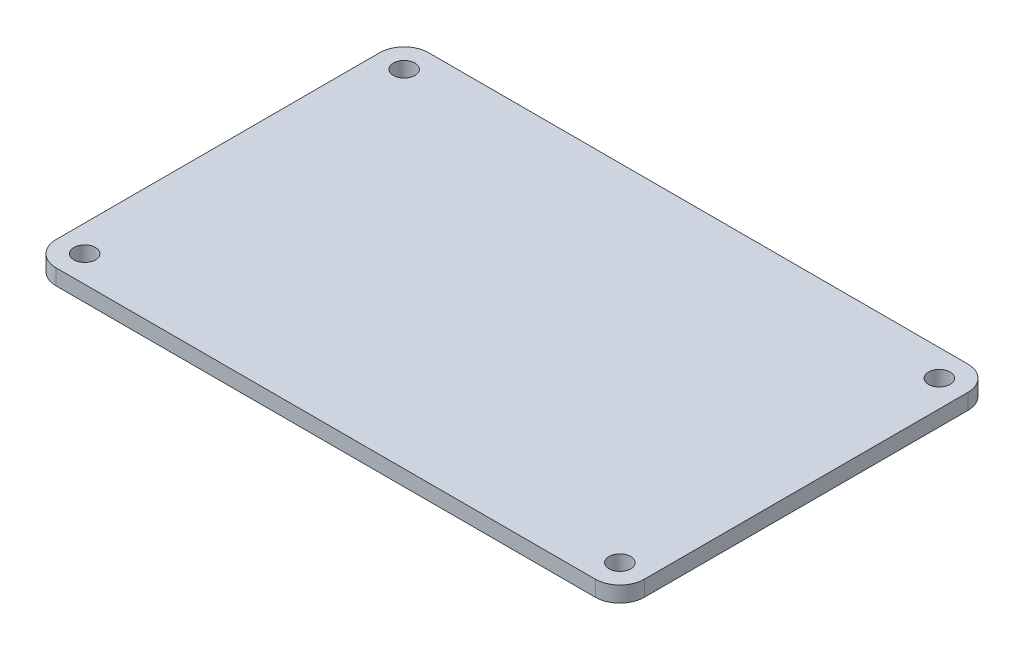
ISO-10303-21;
HEADER;
FILE_DESCRIPTION(('STEP AP214'),'2;1');
FILE_NAME('part.step','',(''),(''),'','','');
FILE_SCHEMA(('AUTOMOTIVE_DESIGN { 1 0 10303 214 1 1 1 1 }'));
ENDSEC;
DATA;
#1=APPLICATION_CONTEXT('core data for automotive mechanical design processes');
#2=APPLICATION_PROTOCOL_DEFINITION('international standard','automotive_design',2000,#1);
#3=PRODUCT_CONTEXT('',#1,'mechanical');
#4=PRODUCT('Part','Part','',(#3));
#5=PRODUCT_RELATED_PRODUCT_CATEGORY('part','',(#4));
#6=PRODUCT_DEFINITION_FORMATION('','',#4);
#7=PRODUCT_DEFINITION_CONTEXT('part definition',#1,'design');
#8=PRODUCT_DEFINITION('design','',#6,#7);
#9=PRODUCT_DEFINITION_SHAPE('','',#8);
#10=(LENGTH_UNIT() NAMED_UNIT(*) SI_UNIT(.MILLI.,.METRE.));
#11=(NAMED_UNIT(*) PLANE_ANGLE_UNIT() SI_UNIT($,.RADIAN.));
#12=(NAMED_UNIT(*) SI_UNIT($,.STERADIAN.) SOLID_ANGLE_UNIT());
#13=UNCERTAINTY_MEASURE_WITH_UNIT(LENGTH_MEASURE(1.E-05),#10,'distance_accuracy_value','');
#14=(GEOMETRIC_REPRESENTATION_CONTEXT(3) GLOBAL_UNCERTAINTY_ASSIGNED_CONTEXT((#13)) GLOBAL_UNIT_ASSIGNED_CONTEXT((#10,
#11,#12)) REPRESENTATION_CONTEXT('',''));
#15=CARTESIAN_POINT('',(0.,0.,0.));
#16=DIRECTION('',(0.,0.,1.));
#17=DIRECTION('',(1.,0.,0.));
#18=AXIS2_PLACEMENT_3D('',#15,#16,#17);
#19=CARTESIAN_POINT('',(-27.5,1.6,-16.5));
#20=DIRECTION('',(0.,-1.,0.));
#21=DIRECTION('',(0.,0.,-1.));
#22=AXIS2_PLACEMENT_3D('',#19,#20,#21);
#23=CYLINDRICAL_SURFACE('',#22,2.5);
#24=CARTESIAN_POINT('',(-27.5,0.,-16.5));
#25=DIRECTION('',(0.,1.,0.));
#26=DIRECTION('',(0.,0.,1.));
#27=AXIS2_PLACEMENT_3D('',#24,#25,#26);
#28=CIRCLE('',#27,2.5);
#29=CARTESIAN_POINT('',(-27.5,0.,-19.));
#30=VERTEX_POINT('',#29);
#31=CARTESIAN_POINT('',(-30.,0.,-16.5));
#32=VERTEX_POINT('',#31);
#33=EDGE_CURVE('E140',#30,#32,#28,.T.);
#34=ORIENTED_EDGE('',*,*,#33,.T.);
#35=DIRECTION('',(0.,-1.,0.));
#36=VECTOR('',#35,1.);
#37=CARTESIAN_POINT('',(-30.,1.6,-16.5));
#38=LINE('',#37,#36);
#39=CARTESIAN_POINT('',(-30.,1.6,-16.5));
#40=VERTEX_POINT('',#39);
#41=EDGE_CURVE('E11',#40,#32,#38,.T.);
#42=ORIENTED_EDGE('',*,*,#41,.F.);
#43=CARTESIAN_POINT('',(-27.5,1.6,-16.5));
#44=DIRECTION('',(0.,1.,0.));
#45=DIRECTION('',(0.,0.,1.));
#46=AXIS2_PLACEMENT_3D('',#43,#44,#45);
#47=CIRCLE('',#46,2.5);
#48=CARTESIAN_POINT('',(-27.5,1.6,-19.));
#49=VERTEX_POINT('',#48);
#50=EDGE_CURVE('E163',#49,#40,#47,.T.);
#51=ORIENTED_EDGE('',*,*,#50,.F.);
#52=DIRECTION('',(0.,-1.,0.));
#53=VECTOR('',#52,1.);
#54=CARTESIAN_POINT('',(-27.5,1.6,-19.));
#55=LINE('',#54,#53);
#56=EDGE_CURVE('E136',#49,#30,#55,.T.);
#57=ORIENTED_EDGE('',*,*,#56,.T.);
#58=EDGE_LOOP('',(#34,#42,#51,#57));
#59=FACE_BOUND('',#58,.T.);
#60=ADVANCED_FACE('F39',(#59),#23,.T.);
#61=CARTESIAN_POINT('',(-30.,1.6,-16.5));
#62=DIRECTION('',(1.,0.,0.));
#63=DIRECTION('',(0.,0.,-1.));
#64=AXIS2_PLACEMENT_3D('',#61,#62,#63);
#65=PLANE('',#64);
#66=DIRECTION('',(0.,0.,1.));
#67=VECTOR('',#66,1.);
#68=CARTESIAN_POINT('',(-30.,0.,-16.5));
#69=LINE('',#68,#67);
#70=CARTESIAN_POINT('',(-30.,0.,16.5));
#71=VERTEX_POINT('',#70);
#72=EDGE_CURVE('E144',#32,#71,#69,.T.);
#73=ORIENTED_EDGE('',*,*,#72,.T.);
#74=DIRECTION('',(0.,-1.,0.));
#75=VECTOR('',#74,1.);
#76=CARTESIAN_POINT('',(-30.,1.6,16.5));
#77=LINE('',#76,#75);
#78=CARTESIAN_POINT('',(-30.,1.6,16.5));
#79=VERTEX_POINT('',#78);
#80=EDGE_CURVE('E48',#79,#71,#77,.T.);
#81=ORIENTED_EDGE('',*,*,#80,.F.);
#82=DIRECTION('',(0.,0.,1.));
#83=VECTOR('',#82,1.);
#84=CARTESIAN_POINT('',(-30.,1.6,-16.5));
#85=LINE('',#84,#83);
#86=EDGE_CURVE('E99',#40,#79,#85,.T.);
#87=ORIENTED_EDGE('',*,*,#86,.F.);
#88=ORIENTED_EDGE('',*,*,#41,.T.);
#89=EDGE_LOOP('',(#73,#81,#87,#88));
#90=FACE_BOUND('',#89,.T.);
#91=ADVANCED_FACE('F267',(#90),#65,.F.);
#92=CARTESIAN_POINT('',(-27.5,1.6,16.5));
#93=DIRECTION('',(0.,-1.,0.));
#94=DIRECTION('',(0.,0.,-1.));
#95=AXIS2_PLACEMENT_3D('',#92,#93,#94);
#96=CYLINDRICAL_SURFACE('',#95,2.5);
#97=CARTESIAN_POINT('',(-27.5,0.,16.5));
#98=DIRECTION('',(0.,1.,0.));
#99=DIRECTION('',(0.,0.,-1.));
#100=AXIS2_PLACEMENT_3D('',#97,#98,#99);
#101=CIRCLE('',#100,2.5);
#102=CARTESIAN_POINT('',(-27.5,0.,19.));
#103=VERTEX_POINT('',#102);
#104=EDGE_CURVE('E148',#71,#103,#101,.T.);
#105=ORIENTED_EDGE('',*,*,#104,.T.);
#106=DIRECTION('',(0.,-1.,0.));
#107=VECTOR('',#106,1.);
#108=CARTESIAN_POINT('',(-27.5,1.6,19.));
#109=LINE('',#108,#107);
#110=CARTESIAN_POINT('',(-27.5,1.6,19.));
#111=VERTEX_POINT('',#110);
#112=EDGE_CURVE('E174',#111,#103,#109,.T.);
#113=ORIENTED_EDGE('',*,*,#112,.F.);
#114=CARTESIAN_POINT('',(-27.5,1.6,16.5));
#115=DIRECTION('',(0.,1.,0.));
#116=DIRECTION('',(0.,0.,-1.));
#117=AXIS2_PLACEMENT_3D('',#114,#115,#116);
#118=CIRCLE('',#117,2.5);
#119=EDGE_CURVE('E184',#79,#111,#118,.T.);
#120=ORIENTED_EDGE('',*,*,#119,.F.);
#121=ORIENTED_EDGE('',*,*,#80,.T.);
#122=EDGE_LOOP('',(#105,#113,#120,#121));
#123=FACE_BOUND('',#122,.T.);
#124=ADVANCED_FACE('F182',(#123),#96,.T.);
#125=CARTESIAN_POINT('',(-27.5,1.6,19.));
#126=DIRECTION('',(0.,0.,-1.));
#127=DIRECTION('',(-1.,0.,0.));
#128=AXIS2_PLACEMENT_3D('',#125,#126,#127);
#129=PLANE('',#128);
#130=DIRECTION('',(1.,0.,0.));
#131=VECTOR('',#130,1.);
#132=CARTESIAN_POINT('',(-27.5,0.,19.));
#133=LINE('',#132,#131);
#134=CARTESIAN_POINT('',(27.5,0.,19.));
#135=VERTEX_POINT('',#134);
#136=EDGE_CURVE('E151',#103,#135,#133,.T.);
#137=ORIENTED_EDGE('',*,*,#136,.T.);
#138=DIRECTION('',(0.,-1.,0.));
#139=VECTOR('',#138,1.);
#140=CARTESIAN_POINT('',(27.5,1.6,19.));
#141=LINE('',#140,#139);
#142=CARTESIAN_POINT('',(27.5,1.6,19.));
#143=VERTEX_POINT('',#142);
#144=EDGE_CURVE('E170',#143,#135,#141,.T.);
#145=ORIENTED_EDGE('',*,*,#144,.F.);
#146=DIRECTION('',(1.,0.,0.));
#147=VECTOR('',#146,1.);
#148=CARTESIAN_POINT('',(-27.5,1.6,19.));
#149=LINE('',#148,#147);
#150=EDGE_CURVE('E197',#111,#143,#149,.T.);
#151=ORIENTED_EDGE('',*,*,#150,.F.);
#152=ORIENTED_EDGE('',*,*,#112,.T.);
#153=EDGE_LOOP('',(#137,#145,#151,#152));
#154=FACE_BOUND('',#153,.T.);
#155=ADVANCED_FACE('F192',(#154),#129,.F.);
#156=CARTESIAN_POINT('',(27.5,1.6,16.5));
#157=DIRECTION('',(0.,-1.,0.));
#158=DIRECTION('',(0.,0.,-1.));
#159=AXIS2_PLACEMENT_3D('',#156,#157,#158);
#160=CYLINDRICAL_SURFACE('',#159,2.5);
#161=CARTESIAN_POINT('',(27.5,0.,16.5));
#162=DIRECTION('',(0.,1.,0.));
#163=DIRECTION('',(0.,0.,1.));
#164=AXIS2_PLACEMENT_3D('',#161,#162,#163);
#165=CIRCLE('',#164,2.5);
#166=CARTESIAN_POINT('',(30.,0.,16.5));
#167=VERTEX_POINT('',#166);
#168=EDGE_CURVE('E154',#135,#167,#165,.T.);
#169=ORIENTED_EDGE('',*,*,#168,.T.);
#170=DIRECTION('',(0.,-1.,0.));
#171=VECTOR('',#170,1.);
#172=CARTESIAN_POINT('',(30.,1.6,16.5));
#173=LINE('',#172,#171);
#174=CARTESIAN_POINT('',(30.,1.6,16.5));
#175=VERTEX_POINT('',#174);
#176=EDGE_CURVE('E129',#175,#167,#173,.T.);
#177=ORIENTED_EDGE('',*,*,#176,.F.);
#178=CARTESIAN_POINT('',(27.5,1.6,16.5));
#179=DIRECTION('',(0.,1.,0.));
#180=DIRECTION('',(0.,0.,1.));
#181=AXIS2_PLACEMENT_3D('',#178,#179,#180);
#182=CIRCLE('',#181,2.5);
#183=EDGE_CURVE('E118',#143,#175,#182,.T.);
#184=ORIENTED_EDGE('',*,*,#183,.F.);
#185=ORIENTED_EDGE('',*,*,#144,.T.);
#186=EDGE_LOOP('',(#169,#177,#184,#185));
#187=FACE_BOUND('',#186,.T.);
#188=ADVANCED_FACE('F195',(#187),#160,.T.);
#189=CARTESIAN_POINT('',(30.,1.6,-16.5));
#190=DIRECTION('',(-1.,0.,0.));
#191=DIRECTION('',(0.,0.,1.));
#192=AXIS2_PLACEMENT_3D('',#189,#190,#191);
#193=PLANE('',#192);
#194=DIRECTION('',(0.,0.,-1.));
#195=VECTOR('',#194,1.);
#196=CARTESIAN_POINT('',(30.,0.,-16.5));
#197=LINE('',#196,#195);
#198=CARTESIAN_POINT('',(30.,0.,-16.5));
#199=VERTEX_POINT('',#198);
#200=EDGE_CURVE('E127',#167,#199,#197,.T.);
#201=ORIENTED_EDGE('',*,*,#200,.T.);
#202=DIRECTION('',(0.,-1.,0.));
#203=VECTOR('',#202,1.);
#204=CARTESIAN_POINT('',(30.,1.6,-16.5));
#205=LINE('',#204,#203);
#206=CARTESIAN_POINT('',(30.,1.6,-16.5));
#207=VERTEX_POINT('',#206);
#208=EDGE_CURVE('E124',#207,#199,#205,.T.);
#209=ORIENTED_EDGE('',*,*,#208,.F.);
#210=DIRECTION('',(0.,0.,-1.));
#211=VECTOR('',#210,1.);
#212=CARTESIAN_POINT('',(30.,1.6,-16.5));
#213=LINE('',#212,#211);
#214=EDGE_CURVE('E112',#175,#207,#213,.T.);
#215=ORIENTED_EDGE('',*,*,#214,.F.);
#216=ORIENTED_EDGE('',*,*,#176,.T.);
#217=EDGE_LOOP('',(#201,#209,#215,#216));
#218=FACE_BOUND('',#217,.T.);
#219=ADVANCED_FACE('F125',(#218),#193,.F.);
#220=CARTESIAN_POINT('',(27.5,1.6,-16.5));
#221=DIRECTION('',(0.,-1.,0.));
#222=DIRECTION('',(0.,0.,-1.));
#223=AXIS2_PLACEMENT_3D('',#220,#221,#222);
#224=CYLINDRICAL_SURFACE('',#223,2.5);
#225=CARTESIAN_POINT('',(27.5,0.,-16.5));
#226=DIRECTION('',(0.,1.,0.));
#227=DIRECTION('',(0.,0.,-1.));
#228=AXIS2_PLACEMENT_3D('',#225,#226,#227);
#229=CIRCLE('',#228,2.5);
#230=CARTESIAN_POINT('',(27.5,0.,-19.));
#231=VERTEX_POINT('',#230);
#232=EDGE_CURVE('E85',#199,#231,#229,.T.);
#233=ORIENTED_EDGE('',*,*,#232,.T.);
#234=DIRECTION('',(0.,-1.,0.));
#235=VECTOR('',#234,1.);
#236=CARTESIAN_POINT('',(27.5,1.6,-19.));
#237=LINE('',#236,#235);
#238=CARTESIAN_POINT('',(27.5,1.6,-19.));
#239=VERTEX_POINT('',#238);
#240=EDGE_CURVE('E130',#239,#231,#237,.T.);
#241=ORIENTED_EDGE('',*,*,#240,.F.);
#242=CARTESIAN_POINT('',(27.5,1.6,-16.5));
#243=DIRECTION('',(0.,1.,0.));
#244=DIRECTION('',(0.,0.,-1.));
#245=AXIS2_PLACEMENT_3D('',#242,#243,#244);
#246=CIRCLE('',#245,2.5);
#247=EDGE_CURVE('E116',#207,#239,#246,.T.);
#248=ORIENTED_EDGE('',*,*,#247,.F.);
#249=ORIENTED_EDGE('',*,*,#208,.T.);
#250=EDGE_LOOP('',(#233,#241,#248,#249));
#251=FACE_BOUND('',#250,.T.);
#252=ADVANCED_FACE('F132',(#251),#224,.T.);
#253=CARTESIAN_POINT('',(-27.5,1.6,-19.));
#254=DIRECTION('',(0.,0.,1.));
#255=DIRECTION('',(1.,0.,0.));
#256=AXIS2_PLACEMENT_3D('',#253,#254,#255);
#257=PLANE('',#256);
#258=DIRECTION('',(-1.,0.,0.));
#259=VECTOR('',#258,1.);
#260=CARTESIAN_POINT('',(-27.5,0.,-19.));
#261=LINE('',#260,#259);
#262=EDGE_CURVE('E91',#231,#30,#261,.T.);
#263=ORIENTED_EDGE('',*,*,#262,.T.);
#264=ORIENTED_EDGE('',*,*,#56,.F.);
#265=DIRECTION('',(-1.,0.,0.));
#266=VECTOR('',#265,1.);
#267=CARTESIAN_POINT('',(-27.5,1.6,-19.));
#268=LINE('',#267,#266);
#269=EDGE_CURVE('E56',#239,#49,#268,.T.);
#270=ORIENTED_EDGE('',*,*,#269,.F.);
#271=ORIENTED_EDGE('',*,*,#240,.T.);
#272=EDGE_LOOP('',(#263,#264,#270,#271));
#273=FACE_BOUND('',#272,.T.);
#274=ADVANCED_FACE('F251',(#273),#257,.F.);
#275=CARTESIAN_POINT('',(-27.5,1.6,-16.5));
#276=DIRECTION('',(0.,1.,0.));
#277=DIRECTION('',(0.,0.,1.));
#278=AXIS2_PLACEMENT_3D('',#275,#276,#277);
#279=PLANE('',#278);
#280=CARTESIAN_POINT('',(-27.29,1.6,16.29));
#281=DIRECTION('',(0.,1.,0.));
#282=DIRECTION('',(0.,0.,1.));
#283=AXIS2_PLACEMENT_3D('',#280,#281,#282);
#284=CIRCLE('',#283,1.1);
#285=CARTESIAN_POINT('',(-27.29,1.6,17.39));
#286=VERTEX_POINT('',#285);
#287=EDGE_CURVE('E215',#286,#286,#284,.T.);
#288=ORIENTED_EDGE('',*,*,#287,.F.);
#289=EDGE_LOOP('',(#288));
#290=FACE_BOUND('',#289,.T.);
#291=CARTESIAN_POINT('',(27.29,1.6,16.29));
#292=DIRECTION('',(0.,1.,0.));
#293=DIRECTION('',(0.,0.,1.));
#294=AXIS2_PLACEMENT_3D('',#291,#292,#293);
#295=CIRCLE('',#294,1.1);
#296=CARTESIAN_POINT('',(27.29,1.6,17.39));
#297=VERTEX_POINT('',#296);
#298=EDGE_CURVE('E223',#297,#297,#295,.T.);
#299=ORIENTED_EDGE('',*,*,#298,.F.);
#300=EDGE_LOOP('',(#299));
#301=FACE_BOUND('',#300,.T.);
#302=CARTESIAN_POINT('',(27.29,1.6,-16.29));
#303=DIRECTION('',(0.,1.,0.));
#304=DIRECTION('',(0.,0.,1.));
#305=AXIS2_PLACEMENT_3D('',#302,#303,#304);
#306=CIRCLE('',#305,1.1);
#307=CARTESIAN_POINT('',(27.29,1.6,-15.19));
#308=VERTEX_POINT('',#307);
#309=EDGE_CURVE('E231',#308,#308,#306,.T.);
#310=ORIENTED_EDGE('',*,*,#309,.F.);
#311=EDGE_LOOP('',(#310));
#312=FACE_BOUND('',#311,.T.);
#313=CARTESIAN_POINT('',(-27.29,1.6,-16.29));
#314=DIRECTION('',(0.,1.,0.));
#315=DIRECTION('',(0.,0.,1.));
#316=AXIS2_PLACEMENT_3D('',#313,#314,#315);
#317=CIRCLE('',#316,1.1);
#318=CARTESIAN_POINT('',(-27.29,1.6,-15.19));
#319=VERTEX_POINT('',#318);
#320=EDGE_CURVE('E207',#319,#319,#317,.T.);
#321=ORIENTED_EDGE('',*,*,#320,.F.);
#322=EDGE_LOOP('',(#321));
#323=FACE_BOUND('',#322,.T.);
#324=ORIENTED_EDGE('',*,*,#50,.T.);
#325=ORIENTED_EDGE('',*,*,#86,.T.);
#326=ORIENTED_EDGE('',*,*,#119,.T.);
#327=ORIENTED_EDGE('',*,*,#150,.T.);
#328=ORIENTED_EDGE('',*,*,#183,.T.);
#329=ORIENTED_EDGE('',*,*,#214,.T.);
#330=ORIENTED_EDGE('',*,*,#247,.T.);
#331=ORIENTED_EDGE('',*,*,#269,.T.);
#332=EDGE_LOOP('',(#324,#325,#326,#327,#328,#329,#330,#331));
#333=FACE_BOUND('',#332,.T.);
#334=ADVANCED_FACE('F114',(#290,#301,#312,#323,#333),#279,.T.);
#335=CARTESIAN_POINT('',(-27.5,0.,-16.5));
#336=DIRECTION('',(0.,1.,0.));
#337=DIRECTION('',(0.,0.,1.));
#338=AXIS2_PLACEMENT_3D('',#335,#336,#337);
#339=PLANE('',#338);
#340=CARTESIAN_POINT('',(-27.29,0.,16.29));
#341=DIRECTION('',(0.,1.,0.));
#342=DIRECTION('',(0.,0.,1.));
#343=AXIS2_PLACEMENT_3D('',#340,#341,#342);
#344=CIRCLE('',#343,1.1);
#345=CARTESIAN_POINT('',(-27.29,0.,17.39));
#346=VERTEX_POINT('',#345);
#347=EDGE_CURVE('E219',#346,#346,#344,.T.);
#348=ORIENTED_EDGE('',*,*,#347,.T.);
#349=EDGE_LOOP('',(#348));
#350=FACE_BOUND('',#349,.T.);
#351=CARTESIAN_POINT('',(27.29,0.,16.29));
#352=DIRECTION('',(0.,1.,0.));
#353=DIRECTION('',(0.,0.,1.));
#354=AXIS2_PLACEMENT_3D('',#351,#352,#353);
#355=CIRCLE('',#354,1.1);
#356=CARTESIAN_POINT('',(27.29,0.,17.39));
#357=VERTEX_POINT('',#356);
#358=EDGE_CURVE('E227',#357,#357,#355,.T.);
#359=ORIENTED_EDGE('',*,*,#358,.T.);
#360=EDGE_LOOP('',(#359));
#361=FACE_BOUND('',#360,.T.);
#362=CARTESIAN_POINT('',(27.29,0.,-16.29));
#363=DIRECTION('',(0.,1.,0.));
#364=DIRECTION('',(0.,0.,1.));
#365=AXIS2_PLACEMENT_3D('',#362,#363,#364);
#366=CIRCLE('',#365,1.1);
#367=CARTESIAN_POINT('',(27.29,0.,-15.19));
#368=VERTEX_POINT('',#367);
#369=EDGE_CURVE('E211',#368,#368,#366,.T.);
#370=ORIENTED_EDGE('',*,*,#369,.T.);
#371=EDGE_LOOP('',(#370));
#372=FACE_BOUND('',#371,.T.);
#373=CARTESIAN_POINT('',(-27.29,0.,-16.29));
#374=DIRECTION('',(0.,1.,0.));
#375=DIRECTION('',(0.,0.,1.));
#376=AXIS2_PLACEMENT_3D('',#373,#374,#375);
#377=CIRCLE('',#376,1.1);
#378=CARTESIAN_POINT('',(-27.29,0.,-15.19));
#379=VERTEX_POINT('',#378);
#380=EDGE_CURVE('E145',#379,#379,#377,.T.);
#381=ORIENTED_EDGE('',*,*,#380,.T.);
#382=EDGE_LOOP('',(#381));
#383=FACE_BOUND('',#382,.T.);
#384=ORIENTED_EDGE('',*,*,#33,.F.);
#385=ORIENTED_EDGE('',*,*,#262,.F.);
#386=ORIENTED_EDGE('',*,*,#232,.F.);
#387=ORIENTED_EDGE('',*,*,#200,.F.);
#388=ORIENTED_EDGE('',*,*,#168,.F.);
#389=ORIENTED_EDGE('',*,*,#136,.F.);
#390=ORIENTED_EDGE('',*,*,#104,.F.);
#391=ORIENTED_EDGE('',*,*,#72,.F.);
#392=EDGE_LOOP('',(#384,#385,#386,#387,#388,#389,#390,#391));
#393=FACE_BOUND('',#392,.T.);
#394=ADVANCED_FACE('F188',(#350,#361,#372,#383,#393),#339,.F.);
#395=CARTESIAN_POINT('',(-27.29,0.,-16.29));
#396=DIRECTION('',(0.,1.,0.));
#397=DIRECTION('',(0.,0.,1.));
#398=AXIS2_PLACEMENT_3D('',#395,#396,#397);
#399=CYLINDRICAL_SURFACE('',#398,1.1);
#400=ORIENTED_EDGE('',*,*,#380,.F.);
#401=EDGE_LOOP('',(#400));
#402=FACE_BOUND('',#401,.T.);
#403=ORIENTED_EDGE('',*,*,#320,.T.);
#404=EDGE_LOOP('',(#403));
#405=FACE_BOUND('',#404,.T.);
#406=ADVANCED_FACE('F245',(#402,#405),#399,.F.);
#407=CARTESIAN_POINT('',(27.29,0.,-16.29));
#408=DIRECTION('',(0.,1.,0.));
#409=DIRECTION('',(0.,0.,1.));
#410=AXIS2_PLACEMENT_3D('',#407,#408,#409);
#411=CYLINDRICAL_SURFACE('',#410,1.1);
#412=ORIENTED_EDGE('',*,*,#369,.F.);
#413=EDGE_LOOP('',(#412));
#414=FACE_BOUND('',#413,.T.);
#415=ORIENTED_EDGE('',*,*,#309,.T.);
#416=EDGE_LOOP('',(#415));
#417=FACE_BOUND('',#416,.T.);
#418=ADVANCED_FACE('F241',(#414,#417),#411,.F.);
#419=CARTESIAN_POINT('',(27.29,0.,16.29));
#420=DIRECTION('',(0.,1.,0.));
#421=DIRECTION('',(0.,0.,1.));
#422=AXIS2_PLACEMENT_3D('',#419,#420,#421);
#423=CYLINDRICAL_SURFACE('',#422,1.1);
#424=ORIENTED_EDGE('',*,*,#358,.F.);
#425=EDGE_LOOP('',(#424));
#426=FACE_BOUND('',#425,.T.);
#427=ORIENTED_EDGE('',*,*,#298,.T.);
#428=EDGE_LOOP('',(#427));
#429=FACE_BOUND('',#428,.T.);
#430=ADVANCED_FACE('F244',(#426,#429),#423,.F.);
#431=CARTESIAN_POINT('',(-27.29,0.,16.29));
#432=DIRECTION('',(0.,1.,0.));
#433=DIRECTION('',(0.,0.,1.));
#434=AXIS2_PLACEMENT_3D('',#431,#432,#433);
#435=CYLINDRICAL_SURFACE('',#434,1.1);
#436=ORIENTED_EDGE('',*,*,#347,.F.);
#437=EDGE_LOOP('',(#436));
#438=FACE_BOUND('',#437,.T.);
#439=ORIENTED_EDGE('',*,*,#287,.T.);
#440=EDGE_LOOP('',(#439));
#441=FACE_BOUND('',#440,.T.);
#442=ADVANCED_FACE('F343',(#438,#441),#435,.F.);
#443=CLOSED_SHELL('',(#60,#91,#124,#155,#188,#219,#252,#274,#334,#394,#406,#418,#430,#442));
#444=MANIFOLD_SOLID_BREP('B2',#443);
#445=ADVANCED_BREP_SHAPE_REPRESENTATION('',(#18,#444),#14);
#446=SHAPE_DEFINITION_REPRESENTATION(#9,#445);
ENDSEC;
END-ISO-10303-21;
